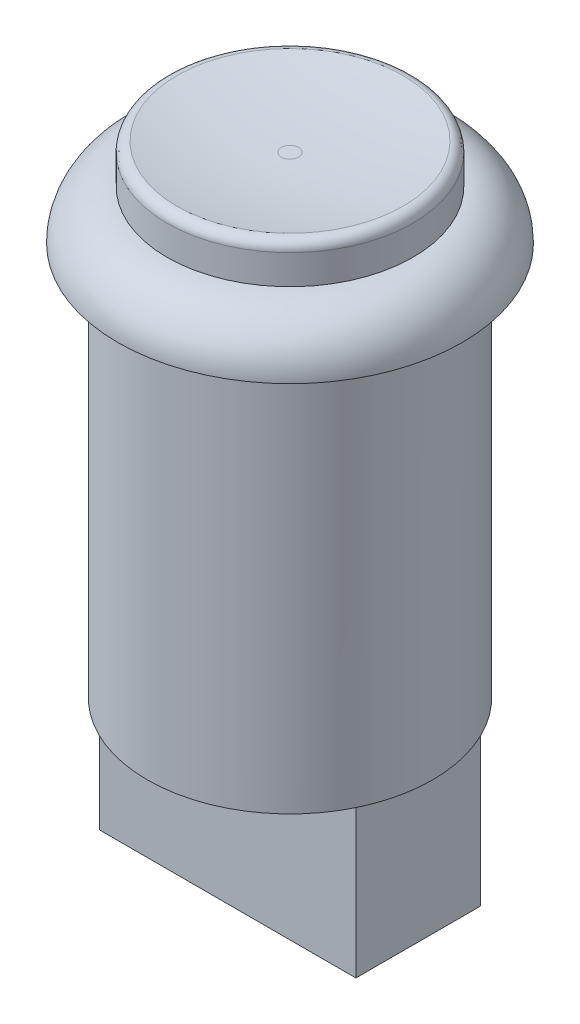
ISO-10303-21;
HEADER;
FILE_DESCRIPTION(('STEP AP214'),'2;1');
FILE_NAME('part.step','',(''),(''),'','','');
FILE_SCHEMA(('AUTOMOTIVE_DESIGN { 1 0 10303 214 1 1 1 1 }'));
ENDSEC;
DATA;
#1=APPLICATION_CONTEXT('core data for automotive mechanical design processes');
#2=APPLICATION_PROTOCOL_DEFINITION('international standard','automotive_design',2000,#1);
#3=PRODUCT_CONTEXT('',#1,'mechanical');
#4=PRODUCT('Part','Part','',(#3));
#5=PRODUCT_RELATED_PRODUCT_CATEGORY('part','',(#4));
#6=PRODUCT_DEFINITION_FORMATION('','',#4);
#7=PRODUCT_DEFINITION_CONTEXT('part definition',#1,'design');
#8=PRODUCT_DEFINITION('design','',#6,#7);
#9=PRODUCT_DEFINITION_SHAPE('','',#8);
#10=(LENGTH_UNIT() NAMED_UNIT(*) SI_UNIT(.MILLI.,.METRE.));
#11=(NAMED_UNIT(*) PLANE_ANGLE_UNIT() SI_UNIT($,.RADIAN.));
#12=(NAMED_UNIT(*) SI_UNIT($,.STERADIAN.) SOLID_ANGLE_UNIT());
#13=UNCERTAINTY_MEASURE_WITH_UNIT(LENGTH_MEASURE(1.E-05),#10,'distance_accuracy_value','');
#14=(GEOMETRIC_REPRESENTATION_CONTEXT(3) GLOBAL_UNCERTAINTY_ASSIGNED_CONTEXT((#13)) GLOBAL_UNIT_ASSIGNED_CONTEXT((#10,
#11,#12)) REPRESENTATION_CONTEXT('',''));
#15=CARTESIAN_POINT('',(0.,0.,0.));
#16=DIRECTION('',(0.,0.,1.));
#17=DIRECTION('',(1.,0.,0.));
#18=AXIS2_PLACEMENT_3D('',#15,#16,#17);
#19=CARTESIAN_POINT('',(0.,-40.,0.));
#20=DIRECTION('',(0.,-1.,0.));
#21=DIRECTION('',(0.,0.,-1.));
#22=AXIS2_PLACEMENT_3D('',#19,#20,#21);
#23=PLANE('',#22);
#24=DIRECTION('',(0.,0.,1.));
#25=VECTOR('',#24,1.);
#26=CARTESIAN_POINT('',(13.0409660113615,-40.,-6.33902243966013));
#27=LINE('',#26,#25);
#28=CARTESIAN_POINT('',(13.0409660113615,-40.,-6.33902243966013));
#29=VERTEX_POINT('',#28);
#30=CARTESIAN_POINT('',(13.0409660113615,-40.,6.33902243966013));
#31=VERTEX_POINT('',#30);
#32=EDGE_CURVE('E100',#29,#31,#27,.T.);
#33=ORIENTED_EDGE('',*,*,#32,.F.);
#34=CARTESIAN_POINT('',(0.,-40.,0.));
#35=DIRECTION('',(0.,-1.,0.));
#36=DIRECTION('',(0.,0.,-1.));
#37=AXIS2_PLACEMENT_3D('',#34,#35,#36);
#38=CIRCLE('',#37,14.5);
#39=EDGE_CURVE('E105',#29,#31,#38,.T.);
#40=ORIENTED_EDGE('',*,*,#39,.T.);
#41=EDGE_LOOP('',(#33,#40));
#42=FACE_BOUND('',#41,.T.);
#43=ADVANCED_FACE('F36',(#42),#23,.T.);
#44=DIRECTION('',(1.,0.,0.));
#45=VECTOR('',#44,1.);
#46=CARTESIAN_POINT('',(-13.0409660113615,-40.,-6.33902243966013));
#47=LINE('',#46,#45);
#48=CARTESIAN_POINT('',(-13.0409660113615,-40.,-6.33902243966013));
#49=VERTEX_POINT('',#48);
#50=EDGE_CURVE('E50',#49,#29,#47,.T.);
#51=ORIENTED_EDGE('',*,*,#50,.F.);
#52=EDGE_CURVE('E101',#49,#29,#38,.T.);
#53=ORIENTED_EDGE('',*,*,#52,.T.);
#54=EDGE_LOOP('',(#51,#53));
#55=FACE_BOUND('',#54,.T.);
#56=ADVANCED_FACE('F141',(#55),#23,.T.);
#57=DIRECTION('',(0.,0.,-1.));
#58=VECTOR('',#57,1.);
#59=CARTESIAN_POINT('',(-13.0409660113615,-40.,-6.33902243966013));
#60=LINE('',#59,#58);
#61=CARTESIAN_POINT('',(-13.0409660113615,-40.,6.33902243966013));
#62=VERTEX_POINT('',#61);
#63=EDGE_CURVE('E165',#62,#49,#60,.T.);
#64=ORIENTED_EDGE('',*,*,#63,.F.);
#65=EDGE_CURVE('E103',#62,#49,#38,.T.);
#66=ORIENTED_EDGE('',*,*,#65,.T.);
#67=EDGE_LOOP('',(#64,#66));
#68=FACE_BOUND('',#67,.T.);
#69=ADVANCED_FACE('F147',(#68),#23,.T.);
#70=CARTESIAN_POINT('',(0.,0.,0.));
#71=DIRECTION('',(0.,1.,0.));
#72=DIRECTION('',(0.,0.,1.));
#73=AXIS2_PLACEMENT_3D('',#70,#71,#72);
#74=PLANE('',#73);
#75=CARTESIAN_POINT('',(0.,0.,0.));
#76=DIRECTION('',(0.,1.,0.));
#77=DIRECTION('',(0.,0.,1.));
#78=AXIS2_PLACEMENT_3D('',#75,#76,#77);
#79=CIRCLE('',#78,17.5);
#80=CARTESIAN_POINT('',(0.,0.,17.5));
#81=VERTEX_POINT('',#80);
#82=EDGE_CURVE('E115',#81,#81,#79,.T.);
#83=ORIENTED_EDGE('',*,*,#82,.F.);
#84=EDGE_LOOP('',(#83));
#85=FACE_BOUND('',#84,.T.);
#86=CARTESIAN_POINT('',(0.,0.,0.));
#87=DIRECTION('',(0.,1.,0.));
#88=DIRECTION('',(0.,0.,1.));
#89=AXIS2_PLACEMENT_3D('',#86,#87,#88);
#90=CIRCLE('',#89,14.5);
#91=CARTESIAN_POINT('',(0.,0.,14.5));
#92=VERTEX_POINT('',#91);
#93=EDGE_CURVE('E11',#92,#92,#90,.F.);
#94=ORIENTED_EDGE('',*,*,#93,.F.);
#95=EDGE_LOOP('',(#94));
#96=FACE_BOUND('',#95,.T.);
#97=ADVANCED_FACE('F154',(#85,#96),#74,.F.);
#98=CARTESIAN_POINT('',(0.,0.,0.));
#99=DIRECTION('',(0.,1.,0.));
#100=DIRECTION('',(0.,0.,1.));
#101=AXIS2_PLACEMENT_3D('',#98,#99,#100);
#102=TOROIDAL_SURFACE('',#101,12.5,5.);
#103=ORIENTED_EDGE('',*,*,#82,.T.);
#104=EDGE_LOOP('',(#103));
#105=FACE_BOUND('',#104,.T.);
#106=CARTESIAN_POINT('',(0.,5.,0.));
#107=DIRECTION('',(0.,1.,0.));
#108=DIRECTION('',(0.,0.,1.));
#109=AXIS2_PLACEMENT_3D('',#106,#107,#108);
#110=CIRCLE('',#109,12.5);
#111=CARTESIAN_POINT('',(0.,5.,12.5));
#112=VERTEX_POINT('',#111);
#113=EDGE_CURVE('E118',#112,#112,#110,.T.);
#114=ORIENTED_EDGE('',*,*,#113,.F.);
#115=EDGE_LOOP('',(#114));
#116=FACE_BOUND('',#115,.T.);
#117=ADVANCED_FACE('F159',(#105,#116),#102,.T.);
#118=CARTESIAN_POINT('',(0.,9.,0.));
#119=DIRECTION('',(0.,-1.,0.));
#120=DIRECTION('',(0.,0.,-1.));
#121=AXIS2_PLACEMENT_3D('',#118,#119,#120);
#122=CYLINDRICAL_SURFACE('',#121,12.5);
#123=CARTESIAN_POINT('',(0.,8.,0.));
#124=DIRECTION('',(0.,1.,0.));
#125=DIRECTION('',(0.,0.,1.));
#126=AXIS2_PLACEMENT_3D('',#123,#124,#125);
#127=CIRCLE('',#126,12.5);
#128=CARTESIAN_POINT('',(0.,8.,12.5));
#129=VERTEX_POINT('',#128);
#130=EDGE_CURVE('E121',#129,#129,#127,.F.);
#131=ORIENTED_EDGE('',*,*,#130,.T.);
#132=EDGE_LOOP('',(#131));
#133=FACE_BOUND('',#132,.T.);
#134=ORIENTED_EDGE('',*,*,#113,.T.);
#135=EDGE_LOOP('',(#134));
#136=FACE_BOUND('',#135,.T.);
#137=ADVANCED_FACE('F261',(#133,#136),#122,.T.);
#138=CARTESIAN_POINT('',(0.,8.,0.));
#139=DIRECTION('',(0.,1.,0.));
#140=DIRECTION('',(0.,0.,1.));
#141=AXIS2_PLACEMENT_3D('',#138,#139,#140);
#142=TOROIDAL_SURFACE('',#141,11.5,1.);
#143=ORIENTED_EDGE('',*,*,#130,.F.);
#144=EDGE_LOOP('',(#143));
#145=FACE_BOUND('',#144,.T.);
#146=CARTESIAN_POINT('',(0.,9.,0.));
#147=DIRECTION('',(0.,1.,0.));
#148=DIRECTION('',(0.,0.,1.));
#149=AXIS2_PLACEMENT_3D('',#146,#147,#148);
#150=CIRCLE('',#149,11.5);
#151=CARTESIAN_POINT('',(0.,9.,11.5));
#152=VERTEX_POINT('',#151);
#153=EDGE_CURVE('E111',#152,#152,#150,.T.);
#154=ORIENTED_EDGE('',*,*,#153,.F.);
#155=EDGE_LOOP('',(#154));
#156=FACE_BOUND('',#155,.T.);
#157=ADVANCED_FACE('F138',(#145,#156),#142,.T.);
#158=CARTESIAN_POINT('',(0.,8.,0.));
#159=DIRECTION('',(0.,1.,0.));
#160=DIRECTION('',(0.,0.,1.));
#161=AXIS2_PLACEMENT_3D('',#158,#159,#160);
#162=PLANE('',#161);
#163=CARTESIAN_POINT('',(0.,8.,0.));
#164=DIRECTION('',(0.,1.,0.));
#165=DIRECTION('',(0.,0.,1.));
#166=AXIS2_PLACEMENT_3D('',#163,#164,#165);
#167=CIRCLE('',#166,0.869854187265363);
#168=CARTESIAN_POINT('',(0.,8.,0.869854187265363));
#169=VERTEX_POINT('',#168);
#170=EDGE_CURVE('E44',#169,#169,#167,.T.);
#171=ORIENTED_EDGE('',*,*,#170,.T.);
#172=EDGE_LOOP('',(#171));
#173=FACE_BOUND('',#172,.T.);
#174=ADVANCED_FACE('F126',(#173),#162,.T.);
#175=CARTESIAN_POINT('',(0.,65.,0.));
#176=DIRECTION('',(0.,-1.,0.));
#177=DIRECTION('',(0.,0.,-1.));
#178=AXIS2_PLACEMENT_3D('',#175,#176,#177);
#179=DEGENERATE_TOROIDAL_SURFACE('',#178,0.869854187265363,57.,.T.);
#180=ORIENTED_EDGE('',*,*,#153,.T.);
#181=EDGE_LOOP('',(#180));
#182=FACE_BOUND('',#181,.T.);
#183=ORIENTED_EDGE('',*,*,#170,.F.);
#184=EDGE_LOOP('',(#183));
#185=FACE_BOUND('',#184,.T.);
#186=ADVANCED_FACE('F38',(#182,#185),#179,.F.);
#187=CARTESIAN_POINT('',(0.,-40.,0.));
#188=DIRECTION('',(0.,1.,0.));
#189=DIRECTION('',(0.,0.,1.));
#190=AXIS2_PLACEMENT_3D('',#187,#188,#189);
#191=CYLINDRICAL_SURFACE('',#190,14.5);
#192=ORIENTED_EDGE('',*,*,#39,.F.);
#193=ORIENTED_EDGE('',*,*,#52,.F.);
#194=ORIENTED_EDGE('',*,*,#65,.F.);
#195=EDGE_CURVE('E112',#31,#62,#38,.T.);
#196=ORIENTED_EDGE('',*,*,#195,.F.);
#197=EDGE_LOOP('',(#192,#193,#194,#196));
#198=FACE_BOUND('',#197,.T.);
#199=ORIENTED_EDGE('',*,*,#93,.T.);
#200=EDGE_LOOP('',(#199));
#201=FACE_BOUND('',#200,.T.);
#202=ADVANCED_FACE('F129',(#198,#201),#191,.T.);
#203=DIRECTION('',(-1.,0.,0.));
#204=VECTOR('',#203,1.);
#205=CARTESIAN_POINT('',(-13.0409660113615,-40.,6.33902243966013));
#206=LINE('',#205,#204);
#207=EDGE_CURVE('E57',#31,#62,#206,.T.);
#208=ORIENTED_EDGE('',*,*,#207,.F.);
#209=ORIENTED_EDGE('',*,*,#195,.T.);
#210=EDGE_LOOP('',(#208,#209));
#211=FACE_BOUND('',#210,.T.);
#212=ADVANCED_FACE('F135',(#211),#23,.T.);
#213=CARTESIAN_POINT('',(13.0409660113615,-55.,-6.33902243966013));
#214=DIRECTION('',(-1.,0.,0.));
#215=DIRECTION('',(0.,0.,1.));
#216=AXIS2_PLACEMENT_3D('',#213,#214,#215);
#217=PLANE('',#216);
#218=ORIENTED_EDGE('',*,*,#32,.T.);
#219=DIRECTION('',(0.,1.,0.));
#220=VECTOR('',#219,1.);
#221=CARTESIAN_POINT('',(13.0409660113615,-55.,6.33902243966013));
#222=LINE('',#221,#220);
#223=CARTESIAN_POINT('',(13.0409660113615,-55.,6.33902243966013));
#224=VERTEX_POINT('',#223);
#225=EDGE_CURVE('E82',#224,#31,#222,.T.);
#226=ORIENTED_EDGE('',*,*,#225,.F.);
#227=DIRECTION('',(0.,0.,1.));
#228=VECTOR('',#227,1.);
#229=CARTESIAN_POINT('',(13.0409660113615,-55.,-6.33902243966013));
#230=LINE('',#229,#228);
#231=CARTESIAN_POINT('',(13.0409660113615,-55.,-6.33902243966013));
#232=VERTEX_POINT('',#231);
#233=EDGE_CURVE('E89',#232,#224,#230,.T.);
#234=ORIENTED_EDGE('',*,*,#233,.F.);
#235=DIRECTION('',(0.,1.,0.));
#236=VECTOR('',#235,1.);
#237=CARTESIAN_POINT('',(13.0409660113615,-55.,-6.33902243966013));
#238=LINE('',#237,#236);
#239=EDGE_CURVE('E174',#232,#29,#238,.T.);
#240=ORIENTED_EDGE('',*,*,#239,.T.);
#241=EDGE_LOOP('',(#218,#226,#234,#240));
#242=FACE_BOUND('',#241,.T.);
#243=ADVANCED_FACE('F99',(#242),#217,.F.);
#244=CARTESIAN_POINT('',(-13.0409660113615,-55.,6.33902243966013));
#245=DIRECTION('',(0.,0.,-1.));
#246=DIRECTION('',(-1.,0.,0.));
#247=AXIS2_PLACEMENT_3D('',#244,#245,#246);
#248=PLANE('',#247);
#249=ORIENTED_EDGE('',*,*,#207,.T.);
#250=DIRECTION('',(0.,1.,0.));
#251=VECTOR('',#250,1.);
#252=CARTESIAN_POINT('',(-13.0409660113615,-55.,6.33902243966013));
#253=LINE('',#252,#251);
#254=CARTESIAN_POINT('',(-13.0409660113615,-55.,6.33902243966013));
#255=VERTEX_POINT('',#254);
#256=EDGE_CURVE('E85',#255,#62,#253,.T.);
#257=ORIENTED_EDGE('',*,*,#256,.F.);
#258=DIRECTION('',(-1.,0.,0.));
#259=VECTOR('',#258,1.);
#260=CARTESIAN_POINT('',(-13.0409660113615,-55.,6.33902243966013));
#261=LINE('',#260,#259);
#262=EDGE_CURVE('E78',#224,#255,#261,.T.);
#263=ORIENTED_EDGE('',*,*,#262,.F.);
#264=ORIENTED_EDGE('',*,*,#225,.T.);
#265=EDGE_LOOP('',(#249,#257,#263,#264));
#266=FACE_BOUND('',#265,.T.);
#267=ADVANCED_FACE('F80',(#266),#248,.F.);
#268=CARTESIAN_POINT('',(-13.0409660113615,-55.,-6.33902243966013));
#269=DIRECTION('',(1.,0.,0.));
#270=DIRECTION('',(0.,0.,-1.));
#271=AXIS2_PLACEMENT_3D('',#268,#269,#270);
#272=PLANE('',#271);
#273=ORIENTED_EDGE('',*,*,#63,.T.);
#274=DIRECTION('',(0.,1.,0.));
#275=VECTOR('',#274,1.);
#276=CARTESIAN_POINT('',(-13.0409660113615,-55.,-6.33902243966013));
#277=LINE('',#276,#275);
#278=CARTESIAN_POINT('',(-13.0409660113615,-55.,-6.33902243966013));
#279=VERTEX_POINT('',#278);
#280=EDGE_CURVE('E106',#279,#49,#277,.T.);
#281=ORIENTED_EDGE('',*,*,#280,.F.);
#282=DIRECTION('',(0.,0.,-1.));
#283=VECTOR('',#282,1.);
#284=CARTESIAN_POINT('',(-13.0409660113615,-55.,-6.33902243966013));
#285=LINE('',#284,#283);
#286=EDGE_CURVE('E88',#255,#279,#285,.T.);
#287=ORIENTED_EDGE('',*,*,#286,.F.);
#288=ORIENTED_EDGE('',*,*,#256,.T.);
#289=EDGE_LOOP('',(#273,#281,#287,#288));
#290=FACE_BOUND('',#289,.T.);
#291=ADVANCED_FACE('F172',(#290),#272,.F.);
#292=CARTESIAN_POINT('',(-13.0409660113615,-55.,-6.33902243966013));
#293=DIRECTION('',(0.,0.,1.));
#294=DIRECTION('',(1.,0.,0.));
#295=AXIS2_PLACEMENT_3D('',#292,#293,#294);
#296=PLANE('',#295);
#297=ORIENTED_EDGE('',*,*,#50,.T.);
#298=ORIENTED_EDGE('',*,*,#239,.F.);
#299=DIRECTION('',(1.,0.,0.));
#300=VECTOR('',#299,1.);
#301=CARTESIAN_POINT('',(-13.0409660113615,-55.,-6.33902243966013));
#302=LINE('',#301,#300);
#303=EDGE_CURVE('E94',#279,#232,#302,.T.);
#304=ORIENTED_EDGE('',*,*,#303,.F.);
#305=ORIENTED_EDGE('',*,*,#280,.T.);
#306=EDGE_LOOP('',(#297,#298,#304,#305));
#307=FACE_BOUND('',#306,.T.);
#308=ADVANCED_FACE('F180',(#307),#296,.F.);
#309=CARTESIAN_POINT('',(0.,-55.,0.));
#310=DIRECTION('',(0.,1.,0.));
#311=DIRECTION('',(0.,0.,1.));
#312=AXIS2_PLACEMENT_3D('',#309,#310,#311);
#313=PLANE('',#312);
#314=ORIENTED_EDGE('',*,*,#233,.T.);
#315=ORIENTED_EDGE('',*,*,#262,.T.);
#316=ORIENTED_EDGE('',*,*,#286,.T.);
#317=ORIENTED_EDGE('',*,*,#303,.T.);
#318=EDGE_LOOP('',(#314,#315,#316,#317));
#319=FACE_BOUND('',#318,.T.);
#320=ADVANCED_FACE('F92',(#319),#313,.F.);
#321=CLOSED_SHELL('',(#43,#56,#69,#97,#117,#137,#157,#174,#186,#202,#212,#243,#267,#291,#308,#320));
#322=MANIFOLD_SOLID_BREP('B2',#321);
#323=ADVANCED_BREP_SHAPE_REPRESENTATION('',(#18,#322),#14);
#324=SHAPE_DEFINITION_REPRESENTATION(#9,#323);
ENDSEC;
END-ISO-10303-21;
